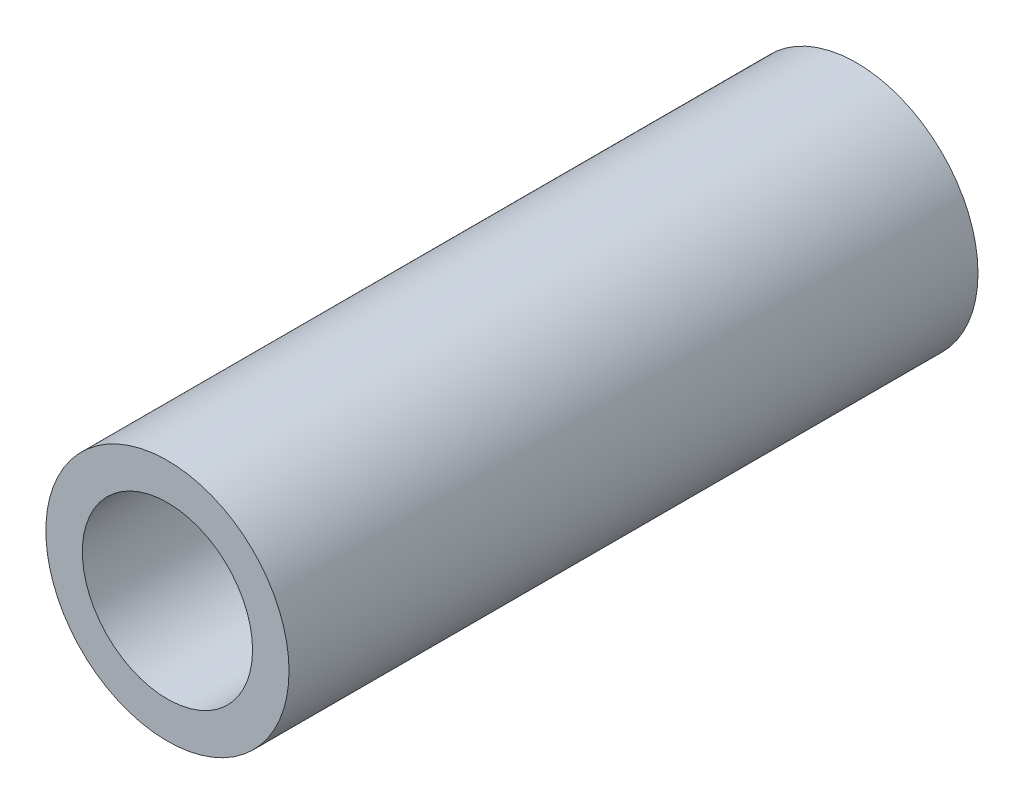
ISO-10303-21;
HEADER;
FILE_DESCRIPTION(('STEP AP214'),'2;1');
FILE_NAME('part.step','',(''),(''),'','','');
FILE_SCHEMA(('AUTOMOTIVE_DESIGN { 1 0 10303 214 1 1 1 1 }'));
ENDSEC;
DATA;
#1=APPLICATION_CONTEXT('core data for automotive mechanical design processes');
#2=APPLICATION_PROTOCOL_DEFINITION('international standard','automotive_design',2000,#1);
#3=PRODUCT_CONTEXT('',#1,'mechanical');
#4=PRODUCT('Part','Part','',(#3));
#5=PRODUCT_RELATED_PRODUCT_CATEGORY('part','',(#4));
#6=PRODUCT_DEFINITION_FORMATION('','',#4);
#7=PRODUCT_DEFINITION_CONTEXT('part definition',#1,'design');
#8=PRODUCT_DEFINITION('design','',#6,#7);
#9=PRODUCT_DEFINITION_SHAPE('','',#8);
#10=(LENGTH_UNIT() NAMED_UNIT(*) SI_UNIT(.MILLI.,.METRE.));
#11=(NAMED_UNIT(*) PLANE_ANGLE_UNIT() SI_UNIT($,.RADIAN.));
#12=(NAMED_UNIT(*) SI_UNIT($,.STERADIAN.) SOLID_ANGLE_UNIT());
#13=UNCERTAINTY_MEASURE_WITH_UNIT(LENGTH_MEASURE(1.E-05),#10,'distance_accuracy_value','');
#14=(GEOMETRIC_REPRESENTATION_CONTEXT(3) GLOBAL_UNCERTAINTY_ASSIGNED_CONTEXT((#13)) GLOBAL_UNIT_ASSIGNED_CONTEXT((#10,
#11,#12)) REPRESENTATION_CONTEXT('',''));
#15=CARTESIAN_POINT('',(0.,0.,0.));
#16=DIRECTION('',(0.,0.,1.));
#17=DIRECTION('',(1.,0.,0.));
#18=AXIS2_PLACEMENT_3D('',#15,#16,#17);
#19=CARTESIAN_POINT('',(0.,0.,17.));
#20=DIRECTION('',(0.,0.,1.));
#21=DIRECTION('',(1.,0.,0.));
#22=AXIS2_PLACEMENT_3D('',#19,#20,#21);
#23=PLANE('',#22);
#24=CARTESIAN_POINT('',(0.,0.,17.));
#25=DIRECTION('',(0.,0.,1.));
#26=DIRECTION('',(1.,0.,0.));
#27=AXIS2_PLACEMENT_3D('',#24,#25,#26);
#28=CIRCLE('',#27,3.);
#29=CARTESIAN_POINT('',(3.,0.,17.));
#30=VERTEX_POINT('',#29);
#31=EDGE_CURVE('E10',#30,#30,#28,.T.);
#32=ORIENTED_EDGE('',*,*,#31,.T.);
#33=EDGE_LOOP('',(#32));
#34=FACE_BOUND('',#33,.T.);
#35=CARTESIAN_POINT('',(0.,0.,17.));
#36=DIRECTION('',(0.,0.,1.));
#37=DIRECTION('',(1.,0.,0.));
#38=AXIS2_PLACEMENT_3D('',#35,#36,#37);
#39=CIRCLE('',#38,2.1);
#40=CARTESIAN_POINT('',(2.1,0.,17.));
#41=VERTEX_POINT('',#40);
#42=EDGE_CURVE('E44',#41,#41,#39,.T.);
#43=ORIENTED_EDGE('',*,*,#42,.F.);
#44=EDGE_LOOP('',(#43));
#45=FACE_BOUND('',#44,.T.);
#46=ADVANCED_FACE('F33',(#34,#45),#23,.T.);
#47=CARTESIAN_POINT('',(0.,0.,0.));
#48=DIRECTION('',(0.,0.,1.));
#49=DIRECTION('',(1.,0.,0.));
#50=AXIS2_PLACEMENT_3D('',#47,#48,#49);
#51=PLANE('',#50);
#52=CARTESIAN_POINT('',(0.,0.,0.));
#53=DIRECTION('',(0.,0.,1.));
#54=DIRECTION('',(1.,0.,0.));
#55=AXIS2_PLACEMENT_3D('',#52,#53,#54);
#56=CIRCLE('',#55,3.);
#57=CARTESIAN_POINT('',(3.,0.,0.));
#58=VERTEX_POINT('',#57);
#59=EDGE_CURVE('E37',#58,#58,#56,.T.);
#60=ORIENTED_EDGE('',*,*,#59,.F.);
#61=EDGE_LOOP('',(#60));
#62=FACE_BOUND('',#61,.T.);
#63=CARTESIAN_POINT('',(0.,0.,0.));
#64=DIRECTION('',(0.,0.,1.));
#65=DIRECTION('',(1.,0.,0.));
#66=AXIS2_PLACEMENT_3D('',#63,#64,#65);
#67=CIRCLE('',#66,2.1);
#68=CARTESIAN_POINT('',(2.1,0.,0.));
#69=VERTEX_POINT('',#68);
#70=EDGE_CURVE('E46',#69,#69,#67,.T.);
#71=ORIENTED_EDGE('',*,*,#70,.T.);
#72=EDGE_LOOP('',(#71));
#73=FACE_BOUND('',#72,.T.);
#74=ADVANCED_FACE('F56',(#62,#73),#51,.F.);
#75=CARTESIAN_POINT('',(0.,0.,17.));
#76=DIRECTION('',(0.,0.,-1.));
#77=DIRECTION('',(-1.,0.,0.));
#78=AXIS2_PLACEMENT_3D('',#75,#76,#77);
#79=CYLINDRICAL_SURFACE('',#78,3.);
#80=ORIENTED_EDGE('',*,*,#31,.F.);
#81=EDGE_LOOP('',(#80));
#82=FACE_BOUND('',#81,.T.);
#83=ORIENTED_EDGE('',*,*,#59,.T.);
#84=EDGE_LOOP('',(#83));
#85=FACE_BOUND('',#84,.T.);
#86=ADVANCED_FACE('F35',(#82,#85),#79,.T.);
#87=CARTESIAN_POINT('',(0.,0.,17.));
#88=DIRECTION('',(0.,0.,-1.));
#89=DIRECTION('',(-1.,0.,0.));
#90=AXIS2_PLACEMENT_3D('',#87,#88,#89);
#91=CYLINDRICAL_SURFACE('',#90,2.1);
#92=ORIENTED_EDGE('',*,*,#42,.T.);
#93=EDGE_LOOP('',(#92));
#94=FACE_BOUND('',#93,.T.);
#95=ORIENTED_EDGE('',*,*,#70,.F.);
#96=EDGE_LOOP('',(#95));
#97=FACE_BOUND('',#96,.T.);
#98=ADVANCED_FACE('F52',(#94,#97),#91,.F.);
#99=CLOSED_SHELL('',(#46,#74,#86,#98));
#100=MANIFOLD_SOLID_BREP('B2',#99);
#101=ADVANCED_BREP_SHAPE_REPRESENTATION('',(#18,#100),#14);
#102=SHAPE_DEFINITION_REPRESENTATION(#9,#101);
ENDSEC;
END-ISO-10303-21;
